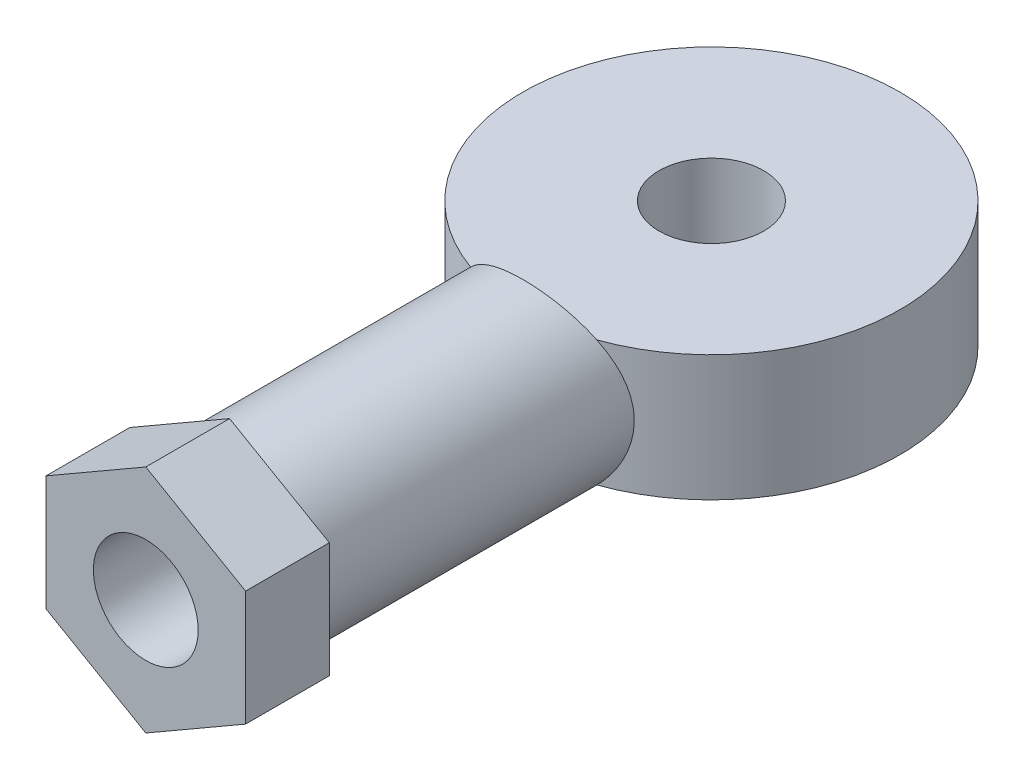
ISO-10303-21;
HEADER;
FILE_DESCRIPTION(('STEP AP214'),'2;1');
FILE_NAME('part.step','',(''),(''),'','','');
FILE_SCHEMA(('AUTOMOTIVE_DESIGN { 1 0 10303 214 1 1 1 1 }'));
ENDSEC;
DATA;
#1=APPLICATION_CONTEXT('core data for automotive mechanical design processes');
#2=APPLICATION_PROTOCOL_DEFINITION('international standard','automotive_design',2000,#1);
#3=PRODUCT_CONTEXT('',#1,'mechanical');
#4=PRODUCT('Part','Part','',(#3));
#5=PRODUCT_RELATED_PRODUCT_CATEGORY('part','',(#4));
#6=PRODUCT_DEFINITION_FORMATION('','',#4);
#7=PRODUCT_DEFINITION_CONTEXT('part definition',#1,'design');
#8=PRODUCT_DEFINITION('design','',#6,#7);
#9=PRODUCT_DEFINITION_SHAPE('','',#8);
#10=(LENGTH_UNIT() NAMED_UNIT(*) SI_UNIT(.MILLI.,.METRE.));
#11=(NAMED_UNIT(*) PLANE_ANGLE_UNIT() SI_UNIT($,.RADIAN.));
#12=(NAMED_UNIT(*) SI_UNIT($,.STERADIAN.) SOLID_ANGLE_UNIT());
#13=UNCERTAINTY_MEASURE_WITH_UNIT(LENGTH_MEASURE(1.E-05),#10,'distance_accuracy_value','');
#14=(GEOMETRIC_REPRESENTATION_CONTEXT(3) GLOBAL_UNCERTAINTY_ASSIGNED_CONTEXT((#13)) GLOBAL_UNIT_ASSIGNED_CONTEXT((#10,
#11,#12)) REPRESENTATION_CONTEXT('',''));
#15=CARTESIAN_POINT('',(0.,0.,0.));
#16=DIRECTION('',(0.,0.,1.));
#17=DIRECTION('',(1.,0.,0.));
#18=AXIS2_PLACEMENT_3D('',#15,#16,#17);
#19=CARTESIAN_POINT('',(0.,3.,5.));
#20=DIRECTION('',(0.,0.,1.));
#21=DIRECTION('',(1.,0.,0.));
#22=AXIS2_PLACEMENT_3D('',#19,#20,#21);
#23=CYLINDRICAL_SURFACE('',#22,4.25);
#24=CARTESIAN_POINT('',(0.,3.,23.));
#25=DIRECTION('',(0.,0.,1.));
#26=DIRECTION('',(1.,0.,0.));
#27=AXIS2_PLACEMENT_3D('',#24,#25,#26);
#28=CIRCLE('',#27,4.25);
#29=CARTESIAN_POINT('',(4.25,3.,23.));
#30=VERTEX_POINT('',#29);
#31=EDGE_CURVE('E175',#30,#30,#28,.T.);
#32=ORIENTED_EDGE('',*,*,#31,.F.);
#33=EDGE_LOOP('',(#32));
#34=FACE_BOUND('',#33,.T.);
#35=CARTESIAN_POINT('',(-3.01039864469807,0.,8.48159772684369));
#36=CARTESIAN_POINT('',(-2.92798697302415,-0.0827006992757874,8.51085549024708));
#37=CARTESIAN_POINT('',(-2.84213227962466,-0.16203395130952,8.53996896478856));
#38=CARTESIAN_POINT('',(-2.66395515199283,-0.313535613947908,8.59721286807979));
#39=CARTESIAN_POINT('',(-2.57163027480233,-0.385701293149573,8.62534291944274));
#40=CARTESIAN_POINT('',(-2.38048875890936,-0.52273684160147,8.6800469180092));
#41=CARTESIAN_POINT('',(-2.28164028441277,-0.587565982491989,8.70661181999646));
#42=CARTESIAN_POINT('',(-2.07843752418483,-0.708989472224683,8.75734310162683));
#43=CARTESIAN_POINT('',(-1.97408404781275,-0.765585027017189,8.78150983235821));
#44=CARTESIAN_POINT('',(-1.76012581005947,-0.87023037623691,8.82688807458339));
#45=CARTESIAN_POINT('',(-1.6505054236901,-0.918252459386683,8.84808995685823));
#46=CARTESIAN_POINT('',(-1.42704487367255,-1.00504762124792,8.88686660267383));
#47=CARTESIAN_POINT('',(-1.31320509126238,-1.04382153322345,8.9044416929708));
#48=CARTESIAN_POINT('',(-1.08257914638173,-1.11155817000089,8.93540746814014));
#49=CARTESIAN_POINT('',(-0.965806307577977,-1.14055881962551,8.94881431168796));
#50=CARTESIAN_POINT('',(-0.729861594213992,-1.18858941891615,8.97113854491265));
#51=CARTESIAN_POINT('',(-0.610691204869528,-1.20762535525866,8.98005863005218));
#52=CARTESIAN_POINT('',(-0.409470634306771,-1.23102195096429,8.991050083418));
#53=CARTESIAN_POINT('',(-0.32779820940515,-1.23813275557335,8.99440114991819));
#54=CARTESIAN_POINT('',(-0.164086748155722,-1.24762290842565,8.99887673903325));
#55=CARTESIAN_POINT('',(-0.0820475887522847,-1.25000052683793,9.00000044761808));
#56=CARTESIAN_POINT('',(0.112507487352976,-1.24999927757523,8.99999938620518));
#57=CARTESIAN_POINT('',(0.225030824558778,-1.24552688682817,8.99788500173908));
#58=CARTESIAN_POINT('',(0.449256458996656,-1.22768600247209,8.98948102749134));
#59=CARTESIAN_POINT('',(0.560958327659712,-1.21431315807871,8.98318939576103));
#60=CARTESIAN_POINT('',(0.782840596984535,-1.1787914204673,8.96657952983101));
#61=CARTESIAN_POINT('',(0.893018327263958,-1.15662875222773,8.9562549758));
#62=CARTESIAN_POINT('',(1.11089932210055,-1.10377765846816,8.93185040397307));
#63=CARTESIAN_POINT('',(1.21860160408556,-1.07308590870671,8.91776892198602));
#64=CARTESIAN_POINT('',(1.53605646482554,-0.968930728338525,8.87051410332611));
#65=CARTESIAN_POINT('',(1.74117203022949,-0.883221777819063,8.83224961699863));
#66=CARTESIAN_POINT('',(2.13371376650894,-0.68217708791253,8.74572694292992));
#67=CARTESIAN_POINT('',(2.32115128250271,-0.566860528945838,8.69747522902911));
#68=CARTESIAN_POINT('',(2.5893632356801,-0.372013238862854,8.61999283432242));
#69=CARTESIAN_POINT('',(2.67790775568925,-0.302121447439359,8.59283940156641));
#70=CARTESIAN_POINT('',(2.8488052746091,-0.15585371750705,8.53770183699303));
#71=CARTESIAN_POINT('',(2.93117257283468,-0.0794936840322524,8.50971984687424));
#72=CARTESIAN_POINT('',(3.01039864469807,0.,8.48159772684369));
#73=B_SPLINE_CURVE_WITH_KNOTS('',3,(#35,#36,#37,#38,#39,#40,#41,#42,#43,#44,#45,#46,#47,#48,#49,
#50,#51,#52,#53,#54,#55,#56,#57,#58,#59,#60,#61,#62,#63,#64,#65,#66,#67,#68,#69,#70,#71,#72),
.UNSPECIFIED.,.F.,.F.,(4,2,2,2,2,2,2,2,2,2,2,2,2,2,2,2,2,2,4),(0.,0.36100483911055,
0.722146725529575,1.08520416177244,1.44820836835558,1.81236543816587,2.17648968486746,
2.53918423642679,2.90166063477097,3.14765426057722,3.39373777283815,3.73117898304924,
4.06878526499079,4.40692273248065,4.74519217560144,5.41867598786905,6.09172459943699,
6.43950023250615,6.78644423838688),.UNSPECIFIED.);
#74=CARTESIAN_POINT('',(-3.01039864469807,0.,8.48159772684369));
#75=VERTEX_POINT('',#74);
#76=CARTESIAN_POINT('',(3.01039864469807,0.,8.48159772684369));
#77=VERTEX_POINT('',#76);
#78=EDGE_CURVE('E135',#75,#77,#73,.T.);
#79=ORIENTED_EDGE('',*,*,#78,.T.);
#80=CARTESIAN_POINT('',(3.01039864469807,6.,8.48159772684369));
#81=CARTESIAN_POINT('',(3.09347285150798,5.91663886327544,8.45211557896374));
#82=CARTESIAN_POINT('',(3.17306077066301,5.82984876980757,8.42248909129286));
#83=CARTESIAN_POINT('',(3.32489897536904,5.64979712619114,8.36371116738));
#84=CARTESIAN_POINT('',(3.39714339848947,5.55653050415388,8.33456012603945));
#85=CARTESIAN_POINT('',(3.53411221704745,5.36360118980779,8.27741434297059));
#86=CARTESIAN_POINT('',(3.59880033248796,5.26391094144638,8.24942556476663));
#87=CARTESIAN_POINT('',(3.71981356560247,5.05903835400034,8.19557034924834));
#88=CARTESIAN_POINT('',(3.77613947074252,4.95385653331741,8.16970371219557));
#89=CARTESIAN_POINT('',(3.88013570075328,4.73822291208056,8.12082883119371));
#90=CARTESIAN_POINT('',(3.92777813421679,4.62775552028212,8.09782987045729));
#91=CARTESIAN_POINT('',(4.01369570762586,4.40258987659313,8.05559061007096));
#92=CARTESIAN_POINT('',(4.05197511510646,4.28789357971188,8.03634859886639));
#93=CARTESIAN_POINT('',(4.11867363610431,4.0552878177845,8.0023701460643));
#94=CARTESIAN_POINT('',(4.14711426855598,3.93738598127306,7.98762388007192));
#95=CARTESIAN_POINT('',(4.19386796817389,3.6990782950046,7.96317595348376));
#96=CARTESIAN_POINT('',(4.21218213783031,3.57867271931675,7.95347374373741));
#97=CARTESIAN_POINT('',(4.2373770913619,3.34601177393237,7.94007685308261));
#98=CARTESIAN_POINT('',(4.24504783075976,3.23386528588899,7.93596759612591));
#99=CARTESIAN_POINT('',(4.25147601827591,3.00920360221286,7.93252579454148));
#100=CARTESIAN_POINT('',(4.25023044673257,2.89668829456897,7.93319486817718));
#101=CARTESIAN_POINT('',(4.23883255032256,2.6722555209794,7.93929105656978));
#102=CARTESIAN_POINT('',(4.22868178787492,2.5603379536253,7.94471733667293));
#103=CARTESIAN_POINT('',(4.19961753290903,2.33794948180376,7.96011748037306));
#104=CARTESIAN_POINT('',(4.18070071214941,2.22747914320632,7.97009307120061));
#105=CARTESIAN_POINT('',(4.11378577551714,1.91209850289954,8.00495321231407));
#106=CARTESIAN_POINT('',(4.05486058726876,1.70998768143906,8.03522296716927));
#107=CARTESIAN_POINT('',(3.90879099126333,1.31843803376613,8.10727539694965));
#108=CARTESIAN_POINT('',(3.82162348850656,1.12900973211291,8.14906749002116));
#109=CARTESIAN_POINT('',(3.62531963668722,0.773051894100289,8.23821593078995));
#110=CARTESIAN_POINT('',(3.51712930256453,0.605930158403899,8.28530496967308));
#111=CARTESIAN_POINT('',(3.27931642079094,0.28933423315033,8.38227809869223));
#112=CARTESIAN_POINT('',(3.14975244811411,0.139813674925143,8.43215431008888));
#113=CARTESIAN_POINT('',(3.01039864469807,0.,8.48159772684369));
#114=B_SPLINE_CURVE_WITH_KNOTS('',3,(#80,#81,#82,#83,#84,#85,#86,#87,#88,#89,#90,#91,#92,#93,
#94,#95,#96,#97,#98,#99,#100,#101,#102,#103,#104,#105,#106,#107,#108,#109,#110,#111,#112,#113),
.UNSPECIFIED.,.F.,.F.,(4,2,2,2,2,2,2,2,2,2,2,2,2,2,2,2,4),(0.,0.363881820486711,
0.728051889107149,1.09390422130228,1.45972207944417,1.82669500155159,2.19350034959463,
2.55949828836047,2.92545637227964,3.26246018390325,3.59957813304586,3.93663694654531,
4.27382383737787,4.90893912694591,5.5445750949937,6.15638354679443,6.76654235864214),.UNSPECIFIED.);
#115=CARTESIAN_POINT('',(3.01039864469807,6.,8.48159772684369));
#116=VERTEX_POINT('',#115);
#117=EDGE_CURVE('E55',#116,#77,#114,.T.);
#118=ORIENTED_EDGE('',*,*,#117,.F.);
#119=CARTESIAN_POINT('',(3.01039864469807,6.,8.48159772684369));
#120=CARTESIAN_POINT('',(2.92790824367343,6.08277973603953,8.51088346897044));
#121=CARTESIAN_POINT('',(2.84196812380461,6.16218564632046,8.54002464657201));
#122=CARTESIAN_POINT('',(2.66361171188871,6.31381548646433,8.5973202659881));
#123=CARTESIAN_POINT('',(2.571193224286,6.38603696122484,8.62547436838038));
#124=CARTESIAN_POINT('',(2.38003301386177,6.52304104528022,8.68017092159719));
#125=CARTESIAN_POINT('',(2.28127069840336,6.58779730181234,8.70670751600722));
#126=CARTESIAN_POINT('',(2.07824725099883,6.7090926692203,8.75738717137499));
#127=CARTESIAN_POINT('',(1.97398670838543,6.76563265833462,8.78153048806287));
#128=CARTESIAN_POINT('',(1.76025753682565,6.87016592626651,8.82686012566223));
#129=CARTESIAN_POINT('',(1.65077488148247,6.91813432963648,8.84803780276689));
#130=CARTESIAN_POINT('',(1.42759740238537,7.00484642777117,8.88677609766163));
#131=CARTESIAN_POINT('',(1.31390285876138,7.04359073475617,8.90433695549623));
#132=CARTESIAN_POINT('',(1.08332045269081,7.11136606726944,8.93531888317323));
#133=CARTESIAN_POINT('',(0.966438579065952,7.14041411185929,8.94874720325426));
#134=CARTESIAN_POINT('',(0.730218209048673,7.18853274496845,8.97111205244641));
#135=CARTESIAN_POINT('',(0.610879912936697,7.20760414359465,8.98004894626049));
#136=CARTESIAN_POINT('',(0.378641715998417,7.23460585133301,8.99273349611889));
#137=CARTESIAN_POINT('',(0.265833369962613,7.24318527998721,8.99678326332585));
#138=CARTESIAN_POINT('',(0.0397784775205806,7.2513189079735,9.00062214408969));
#139=CARTESIAN_POINT('',(-0.0734682029020594,7.25087008589902,9.00040983129316));
#140=CARTESIAN_POINT('',(-0.299440006405073,7.24094594298957,8.99572696161062));
#141=CARTESIAN_POINT('',(-0.412165280534243,7.23147342539354,8.99125772715054));
#142=CARTESIAN_POINT('',(-0.636305973964458,7.20361448353614,8.97818043968852));
#143=CARTESIAN_POINT('',(-0.747720886936529,7.18522472248202,8.96957083738936));
#144=CARTESIAN_POINT('',(-0.963752554849639,7.14069151545059,8.94888000359987));
#145=CARTESIAN_POINT('',(-1.06845850091389,7.11490541910884,8.9369594319302));
#146=CARTESIAN_POINT('',(-1.27522937136514,7.05559806404708,8.90980854363838));
#147=CARTESIAN_POINT('',(-1.37729336534867,7.0220741204591,8.89457707831382));
#148=CARTESIAN_POINT('',(-1.67865712353719,6.91030068020458,8.84440266673445));
#149=CARTESIAN_POINT('',(-1.87318166944836,6.82083850790478,8.80497437469183));
#150=CARTESIAN_POINT('',(-2.2347855807054,6.62058180837328,8.7199993905659));
#151=CARTESIAN_POINT('',(-2.40278807518486,6.51124204277822,8.67491212434078));
#152=CARTESIAN_POINT('',(-2.64120870873057,6.33112933042184,8.60412050763671));
#153=CARTESIAN_POINT('',(-2.71835675048733,6.26846983224964,8.58001900772031));
#154=CARTESIAN_POINT('',(-2.86795388546131,6.13802167881455,8.53118005833563));
#155=CARTESIAN_POINT('',(-2.94040364361378,6.07023375231927,8.50644269955374));
#156=CARTESIAN_POINT('',(-3.01039864469807,6.,8.48159772684369));
#157=B_SPLINE_CURVE_WITH_KNOTS('',3,(#119,#120,#121,#122,#123,#124,#125,#126,#127,#128,#129,
#130,#131,#132,#133,#134,#135,#136,#137,#138,#139,#140,#141,#142,#143,#144,#145,#146,#147,#148,
#149,#150,#151,#152,#153,#154,#155,#156),.UNSPECIFIED.,.F.,.F.,(4,2,2,2,2,2,2,2,2,2,2,2,2,2,2,2,
2,2,4),(0.,0.361349856668882,0.722822774524778,1.08553498756669,1.4482084016636,
1.81191780980218,2.17560307114321,2.53864658685233,2.90166061873213,3.24084684507364,
3.58014658582371,3.91934095642069,4.25866235010122,4.5837594243027,4.90896947028094,
5.5592282213965,6.17349645243601,6.48009389202559,6.78664784458862),.UNSPECIFIED.);
#158=CARTESIAN_POINT('',(-3.01039864469807,6.,8.48159772684369));
#159=VERTEX_POINT('',#158);
#160=EDGE_CURVE('E11',#116,#159,#157,.T.);
#161=ORIENTED_EDGE('',*,*,#160,.T.);
#162=CARTESIAN_POINT('',(-3.01039864469807,0.,8.48159772684369));
#163=CARTESIAN_POINT('',(-3.09347285150798,0.0833611367245638,8.45211557896374));
#164=CARTESIAN_POINT('',(-3.17306077066301,0.170151230192427,8.42248909129286));
#165=CARTESIAN_POINT('',(-3.32489897536904,0.350202873808865,8.36371116738));
#166=CARTESIAN_POINT('',(-3.39714339848947,0.443469495846123,8.33456012603945));
#167=CARTESIAN_POINT('',(-3.53411221704746,0.636398810192209,8.27741434297059));
#168=CARTESIAN_POINT('',(-3.59880033248796,0.736089058553623,8.24942556476663));
#169=CARTESIAN_POINT('',(-3.71981356560247,0.94096164599966,8.19557034924834));
#170=CARTESIAN_POINT('',(-3.77613947074252,1.04614346668259,8.16970371219557));
#171=CARTESIAN_POINT('',(-3.88013570075328,1.26177708791944,8.12082883119371));
#172=CARTESIAN_POINT('',(-3.92777813421679,1.37224447971788,8.09782987045729));
#173=CARTESIAN_POINT('',(-4.01369570762586,1.59741012340687,8.05559061007096));
#174=CARTESIAN_POINT('',(-4.05197511510646,1.71210642028812,8.03634859886639));
#175=CARTESIAN_POINT('',(-4.11867363610431,1.9447121822155,8.0023701460643));
#176=CARTESIAN_POINT('',(-4.14711426855598,2.06261401872694,7.98762388007192));
#177=CARTESIAN_POINT('',(-4.19386796817389,2.3009217049954,7.96317595348376));
#178=CARTESIAN_POINT('',(-4.21218213783031,2.42132728068325,7.95347374373741));
#179=CARTESIAN_POINT('',(-4.2373770913619,2.65398822606763,7.94007685308261));
#180=CARTESIAN_POINT('',(-4.24504783075976,2.76613471411101,7.93596759612591));
#181=CARTESIAN_POINT('',(-4.2514760182759,2.99079639778713,7.93252579454148));
#182=CARTESIAN_POINT('',(-4.25023044673257,3.10331170543103,7.93319486817718));
#183=CARTESIAN_POINT('',(-4.23883255032256,3.3277444790206,7.93929105656978));
#184=CARTESIAN_POINT('',(-4.22868178787492,3.4396620463747,7.94471733667293));
#185=CARTESIAN_POINT('',(-4.19961753290903,3.66205051819624,7.96011748037306));
#186=CARTESIAN_POINT('',(-4.18070071214941,3.77252085679368,7.97009307120061));
#187=CARTESIAN_POINT('',(-4.11378577551714,4.08790149710046,8.00495321231407));
#188=CARTESIAN_POINT('',(-4.05486058726876,4.29001231856094,8.03522296716927));
#189=CARTESIAN_POINT('',(-3.90879099126333,4.68156196623387,8.10727539694964));
#190=CARTESIAN_POINT('',(-3.82162348850656,4.87099026788709,8.14906749002116));
#191=CARTESIAN_POINT('',(-3.62531963668722,5.22694810589971,8.23821593078995));
#192=CARTESIAN_POINT('',(-3.51712930256453,5.3940698415961,8.28530496967308));
#193=CARTESIAN_POINT('',(-3.27931642079094,5.71066576684967,8.38227809869223));
#194=CARTESIAN_POINT('',(-3.14975244811411,5.86018632507486,8.43215431008888));
#195=CARTESIAN_POINT('',(-3.01039864469807,6.,8.48159772684369));
#196=B_SPLINE_CURVE_WITH_KNOTS('',3,(#162,#163,#164,#165,#166,#167,#168,#169,#170,#171,#172,
#173,#174,#175,#176,#177,#178,#179,#180,#181,#182,#183,#184,#185,#186,#187,#188,#189,#190,#191,
#192,#193,#194,#195),.UNSPECIFIED.,.F.,.F.,(4,2,2,2,2,2,2,2,2,2,2,2,2,2,2,2,4),(0.,
0.363881820486711,0.728051889107149,1.09390422130228,1.45972207944417,1.82669500155158,
2.19350034959463,2.55949828836047,2.92545637227964,3.26246018390325,3.59957813304586,
3.93663694654531,4.27382383737787,4.90893912694591,5.5445750949937,6.15638354679443,
6.76654235864214),.UNSPECIFIED.);
#197=EDGE_CURVE('E182',#75,#159,#196,.T.);
#198=ORIENTED_EDGE('',*,*,#197,.F.);
#199=EDGE_LOOP('',(#79,#118,#161,#198));
#200=FACE_BOUND('',#199,.T.);
#201=ADVANCED_FACE('F41',(#34,#200),#23,.T.);
#202=CARTESIAN_POINT('',(0.,6.,0.));
#203=DIRECTION('',(0.,1.,0.));
#204=DIRECTION('',(0.,0.,1.));
#205=AXIS2_PLACEMENT_3D('',#202,#203,#204);
#206=PLANE('',#205);
#207=CARTESIAN_POINT('',(0.,6.,0.));
#208=DIRECTION('',(0.,1.,0.));
#209=DIRECTION('',(0.,0.,1.));
#210=AXIS2_PLACEMENT_3D('',#207,#208,#209);
#211=CIRCLE('',#210,9.);
#212=EDGE_CURVE('E189',#116,#159,#211,.T.);
#213=ORIENTED_EDGE('',*,*,#212,.T.);
#214=CARTESIAN_POINT('',(0.,6.,0.));
#215=DIRECTION('',(0.,1.,0.));
#216=DIRECTION('',(0.,0.,1.));
#217=AXIS2_PLACEMENT_3D('',#214,#215,#216);
#218=CIRCLE('',#217,9.);
#219=EDGE_CURVE('E61',#159,#116,#218,.T.);
#220=ORIENTED_EDGE('',*,*,#219,.T.);
#221=EDGE_LOOP('',(#213,#220));
#222=FACE_BOUND('',#221,.T.);
#223=CARTESIAN_POINT('',(0.,6.,0.));
#224=DIRECTION('',(0.,1.,0.));
#225=DIRECTION('',(0.,0.,1.));
#226=AXIS2_PLACEMENT_3D('',#223,#224,#225);
#227=CIRCLE('',#226,2.5);
#228=CARTESIAN_POINT('',(0.,6.,2.5));
#229=VERTEX_POINT('',#228);
#230=EDGE_CURVE('E191',#229,#229,#227,.T.);
#231=ORIENTED_EDGE('',*,*,#230,.F.);
#232=EDGE_LOOP('',(#231));
#233=FACE_BOUND('',#232,.T.);
#234=ADVANCED_FACE('F164',(#222,#233),#206,.T.);
#235=CARTESIAN_POINT('',(0.,0.,0.));
#236=DIRECTION('',(0.,1.,0.));
#237=DIRECTION('',(0.,0.,1.));
#238=AXIS2_PLACEMENT_3D('',#235,#236,#237);
#239=PLANE('',#238);
#240=CARTESIAN_POINT('',(0.,0.,0.));
#241=DIRECTION('',(0.,-1.,0.));
#242=DIRECTION('',(0.,0.,-1.));
#243=AXIS2_PLACEMENT_3D('',#240,#241,#242);
#244=CIRCLE('',#243,9.);
#245=EDGE_CURVE('E132',#77,#75,#244,.T.);
#246=ORIENTED_EDGE('',*,*,#245,.T.);
#247=CARTESIAN_POINT('',(0.,0.,0.));
#248=DIRECTION('',(0.,1.,0.));
#249=DIRECTION('',(0.,0.,1.));
#250=AXIS2_PLACEMENT_3D('',#247,#248,#249);
#251=CIRCLE('',#250,9.);
#252=EDGE_CURVE('E187',#77,#75,#251,.T.);
#253=ORIENTED_EDGE('',*,*,#252,.F.);
#254=EDGE_LOOP('',(#246,#253));
#255=FACE_BOUND('',#254,.T.);
#256=CARTESIAN_POINT('',(0.,0.,0.));
#257=DIRECTION('',(0.,1.,0.));
#258=DIRECTION('',(0.,0.,1.));
#259=AXIS2_PLACEMENT_3D('',#256,#257,#258);
#260=CIRCLE('',#259,2.5);
#261=CARTESIAN_POINT('',(0.,0.,2.5));
#262=VERTEX_POINT('',#261);
#263=EDGE_CURVE('E195',#262,#262,#260,.T.);
#264=ORIENTED_EDGE('',*,*,#263,.T.);
#265=EDGE_LOOP('',(#264));
#266=FACE_BOUND('',#265,.T.);
#267=ADVANCED_FACE('F169',(#255,#266),#239,.F.);
#268=CARTESIAN_POINT('',(0.,6.,0.));
#269=DIRECTION('',(0.,-1.,0.));
#270=DIRECTION('',(0.,0.,-1.));
#271=AXIS2_PLACEMENT_3D('',#268,#269,#270);
#272=CYLINDRICAL_SURFACE('',#271,9.);
#273=ORIENTED_EDGE('',*,*,#212,.F.);
#274=ORIENTED_EDGE('',*,*,#117,.T.);
#275=ORIENTED_EDGE('',*,*,#252,.T.);
#276=ORIENTED_EDGE('',*,*,#197,.T.);
#277=EDGE_LOOP('',(#273,#274,#275,#276));
#278=FACE_BOUND('',#277,.T.);
#279=ADVANCED_FACE('F43',(#278),#272,.T.);
#280=CARTESIAN_POINT('',(0.,6.,0.));
#281=DIRECTION('',(0.,-1.,0.));
#282=DIRECTION('',(0.,0.,-1.));
#283=AXIS2_PLACEMENT_3D('',#280,#281,#282);
#284=CYLINDRICAL_SURFACE('',#283,2.5);
#285=ORIENTED_EDGE('',*,*,#230,.T.);
#286=EDGE_LOOP('',(#285));
#287=FACE_BOUND('',#286,.T.);
#288=ORIENTED_EDGE('',*,*,#263,.F.);
#289=EDGE_LOOP('',(#288));
#290=FACE_BOUND('',#289,.T.);
#291=ADVANCED_FACE('F158',(#287,#290),#284,.F.);
#292=CARTESIAN_POINT('',(0.,7.25,0.));
#293=DIRECTION('',(0.,-1.,0.));
#294=DIRECTION('',(0.,0.,-1.));
#295=AXIS2_PLACEMENT_3D('',#292,#293,#294);
#296=CYLINDRICAL_SURFACE('',#295,9.);
#297=ORIENTED_EDGE('',*,*,#219,.F.);
#298=ORIENTED_EDGE('',*,*,#160,.F.);
#299=EDGE_LOOP('',(#297,#298));
#300=FACE_BOUND('',#299,.T.);
#301=ADVANCED_FACE('F153',(#300),#296,.F.);
#302=CARTESIAN_POINT('',(0.,-1.25,0.));
#303=DIRECTION('',(0.,1.,0.));
#304=DIRECTION('',(0.,0.,1.));
#305=AXIS2_PLACEMENT_3D('',#302,#303,#304);
#306=CYLINDRICAL_SURFACE('',#305,9.);
#307=ORIENTED_EDGE('',*,*,#78,.F.);
#308=ORIENTED_EDGE('',*,*,#245,.F.);
#309=EDGE_LOOP('',(#307,#308));
#310=FACE_BOUND('',#309,.T.);
#311=ADVANCED_FACE('F149',(#310),#306,.F.);
#312=CARTESIAN_POINT('',(4.76313972081438,5.75000000000006,27.));
#313=DIRECTION('',(-0.499999999999995,-0.866025403784441,0.));
#314=DIRECTION('',(0.866025403784442,-0.499999999999995,0.));
#315=AXIS2_PLACEMENT_3D('',#312,#313,#314);
#316=PLANE('',#315);
#317=DIRECTION('',(-0.866025403784441,0.499999999999995,0.));
#318=VECTOR('',#317,1.);
#319=CARTESIAN_POINT('',(4.76313972081438,5.75000000000006,23.));
#320=LINE('',#319,#318);
#321=CARTESIAN_POINT('',(4.76313972081438,5.75000000000006,23.));
#322=VERTEX_POINT('',#321);
#323=CARTESIAN_POINT('',(0.,8.5,23.));
#324=VERTEX_POINT('',#323);
#325=EDGE_CURVE('E131',#322,#324,#320,.T.);
#326=ORIENTED_EDGE('',*,*,#325,.T.);
#327=DIRECTION('',(0.,0.,-1.));
#328=VECTOR('',#327,1.);
#329=CARTESIAN_POINT('',(0.,8.5,27.));
#330=LINE('',#329,#328);
#331=CARTESIAN_POINT('',(0.,8.5,27.));
#332=VERTEX_POINT('',#331);
#333=EDGE_CURVE('E111',#332,#324,#330,.T.);
#334=ORIENTED_EDGE('',*,*,#333,.F.);
#335=DIRECTION('',(-0.866025403784441,0.499999999999995,0.));
#336=VECTOR('',#335,1.);
#337=CARTESIAN_POINT('',(4.76313972081438,5.75000000000006,27.));
#338=LINE('',#337,#336);
#339=CARTESIAN_POINT('',(4.76313972081438,5.75000000000006,27.));
#340=VERTEX_POINT('',#339);
#341=EDGE_CURVE('E118',#340,#332,#338,.T.);
#342=ORIENTED_EDGE('',*,*,#341,.F.);
#343=DIRECTION('',(0.,0.,-1.));
#344=VECTOR('',#343,1.);
#345=CARTESIAN_POINT('',(4.76313972081438,5.75000000000006,27.));
#346=LINE('',#345,#344);
#347=EDGE_CURVE('E363',#340,#322,#346,.T.);
#348=ORIENTED_EDGE('',*,*,#347,.T.);
#349=EDGE_LOOP('',(#326,#334,#342,#348));
#350=FACE_BOUND('',#349,.T.);
#351=ADVANCED_FACE('F129',(#350),#316,.F.);
#352=CARTESIAN_POINT('',(0.,8.5,27.));
#353=DIRECTION('',(0.500000000000001,-0.866025403784438,0.));
#354=DIRECTION('',(0.866025403784438,0.500000000000001,0.));
#355=AXIS2_PLACEMENT_3D('',#352,#353,#354);
#356=PLANE('',#355);
#357=DIRECTION('',(-0.866025403784438,-0.500000000000001,0.));
#358=VECTOR('',#357,1.);
#359=CARTESIAN_POINT('',(0.,8.5,23.));
#360=LINE('',#359,#358);
#361=CARTESIAN_POINT('',(-4.76313972081442,5.74999999999999,23.));
#362=VERTEX_POINT('',#361);
#363=EDGE_CURVE('E353',#324,#362,#360,.T.);
#364=ORIENTED_EDGE('',*,*,#363,.T.);
#365=DIRECTION('',(0.,0.,-1.));
#366=VECTOR('',#365,1.);
#367=CARTESIAN_POINT('',(-4.76313972081442,5.74999999999999,27.));
#368=LINE('',#367,#366);
#369=CARTESIAN_POINT('',(-4.76313972081442,5.74999999999999,27.));
#370=VERTEX_POINT('',#369);
#371=EDGE_CURVE('E114',#370,#362,#368,.T.);
#372=ORIENTED_EDGE('',*,*,#371,.F.);
#373=DIRECTION('',(-0.866025403784438,-0.500000000000001,0.));
#374=VECTOR('',#373,1.);
#375=CARTESIAN_POINT('',(0.,8.5,27.));
#376=LINE('',#375,#374);
#377=EDGE_CURVE('E107',#332,#370,#376,.T.);
#378=ORIENTED_EDGE('',*,*,#377,.F.);
#379=ORIENTED_EDGE('',*,*,#333,.T.);
#380=EDGE_LOOP('',(#364,#372,#378,#379));
#381=FACE_BOUND('',#380,.T.);
#382=ADVANCED_FACE('F109',(#381),#356,.F.);
#383=CARTESIAN_POINT('',(-4.76313972081442,5.74999999999999,27.));
#384=DIRECTION('',(1.,0.,0.));
#385=DIRECTION('',(0.,1.,0.));
#386=AXIS2_PLACEMENT_3D('',#383,#384,#385);
#387=PLANE('',#386);
#388=DIRECTION('',(0.,-1.,0.));
#389=VECTOR('',#388,1.);
#390=CARTESIAN_POINT('',(-4.76313972081442,5.74999999999999,23.));
#391=LINE('',#390,#389);
#392=CARTESIAN_POINT('',(-4.7631397208144,0.249999999999978,23.));
#393=VERTEX_POINT('',#392);
#394=EDGE_CURVE('E366',#362,#393,#391,.T.);
#395=ORIENTED_EDGE('',*,*,#394,.T.);
#396=DIRECTION('',(0.,0.,-1.));
#397=VECTOR('',#396,1.);
#398=CARTESIAN_POINT('',(-4.7631397208144,0.249999999999978,27.));
#399=LINE('',#398,#397);
#400=CARTESIAN_POINT('',(-4.7631397208144,0.249999999999978,27.));
#401=VERTEX_POINT('',#400);
#402=EDGE_CURVE('E137',#401,#393,#399,.T.);
#403=ORIENTED_EDGE('',*,*,#402,.F.);
#404=DIRECTION('',(0.,-1.,0.));
#405=VECTOR('',#404,1.);
#406=CARTESIAN_POINT('',(-4.76313972081442,5.74999999999999,27.));
#407=LINE('',#406,#405);
#408=EDGE_CURVE('E117',#370,#401,#407,.T.);
#409=ORIENTED_EDGE('',*,*,#408,.F.);
#410=ORIENTED_EDGE('',*,*,#371,.T.);
#411=EDGE_LOOP('',(#395,#403,#409,#410));
#412=FACE_BOUND('',#411,.T.);
#413=ADVANCED_FACE('F263',(#412),#387,.F.);
#414=CARTESIAN_POINT('',(-4.7631397208144,0.249999999999978,27.));
#415=DIRECTION('',(0.499999999999995,0.866025403784441,0.));
#416=DIRECTION('',(-0.866025403784442,0.499999999999995,0.));
#417=AXIS2_PLACEMENT_3D('',#414,#415,#416);
#418=PLANE('',#417);
#419=DIRECTION('',(0.866025403784441,-0.499999999999995,0.));
#420=VECTOR('',#419,1.);
#421=CARTESIAN_POINT('',(-4.7631397208144,0.249999999999978,23.));
#422=LINE('',#421,#420);
#423=CARTESIAN_POINT('',(0.,-2.5,23.));
#424=VERTEX_POINT('',#423);
#425=EDGE_CURVE('E368',#393,#424,#422,.T.);
#426=ORIENTED_EDGE('',*,*,#425,.T.);
#427=DIRECTION('',(0.,0.,-1.));
#428=VECTOR('',#427,1.);
#429=CARTESIAN_POINT('',(0.,-2.5,27.));
#430=LINE('',#429,#428);
#431=CARTESIAN_POINT('',(0.,-2.5,27.));
#432=VERTEX_POINT('',#431);
#433=EDGE_CURVE('E377',#432,#424,#430,.T.);
#434=ORIENTED_EDGE('',*,*,#433,.F.);
#435=DIRECTION('',(0.866025403784441,-0.499999999999995,0.));
#436=VECTOR('',#435,1.);
#437=CARTESIAN_POINT('',(-4.7631397208144,0.249999999999978,27.));
#438=LINE('',#437,#436);
#439=EDGE_CURVE('E359',#401,#432,#438,.T.);
#440=ORIENTED_EDGE('',*,*,#439,.F.);
#441=ORIENTED_EDGE('',*,*,#402,.T.);
#442=EDGE_LOOP('',(#426,#434,#440,#441));
#443=FACE_BOUND('',#442,.T.);
#444=ADVANCED_FACE('F270',(#443),#418,.F.);
#445=CARTESIAN_POINT('',(0.,-2.5,27.));
#446=DIRECTION('',(-0.500000000000007,0.866025403784435,0.));
#447=DIRECTION('',(-0.866025403784435,-0.500000000000007,0.));
#448=AXIS2_PLACEMENT_3D('',#445,#446,#447);
#449=PLANE('',#448);
#450=DIRECTION('',(0.866025403784434,0.500000000000007,0.));
#451=VECTOR('',#450,1.);
#452=CARTESIAN_POINT('',(0.,-2.5,23.));
#453=LINE('',#452,#451);
#454=CARTESIAN_POINT('',(4.76313972081444,0.250000000000044,23.));
#455=VERTEX_POINT('',#454);
#456=EDGE_CURVE('E370',#424,#455,#453,.T.);
#457=ORIENTED_EDGE('',*,*,#456,.T.);
#458=DIRECTION('',(0.,0.,-1.));
#459=VECTOR('',#458,1.);
#460=CARTESIAN_POINT('',(4.76313972081444,0.250000000000044,27.));
#461=LINE('',#460,#459);
#462=CARTESIAN_POINT('',(4.76313972081444,0.250000000000044,27.));
#463=VERTEX_POINT('',#462);
#464=EDGE_CURVE('E374',#463,#455,#461,.T.);
#465=ORIENTED_EDGE('',*,*,#464,.F.);
#466=DIRECTION('',(0.866025403784434,0.500000000000007,0.));
#467=VECTOR('',#466,1.);
#468=CARTESIAN_POINT('',(0.,-2.5,27.));
#469=LINE('',#468,#467);
#470=EDGE_CURVE('E361',#432,#463,#469,.T.);
#471=ORIENTED_EDGE('',*,*,#470,.F.);
#472=ORIENTED_EDGE('',*,*,#433,.T.);
#473=EDGE_LOOP('',(#457,#465,#471,#472));
#474=FACE_BOUND('',#473,.T.);
#475=ADVANCED_FACE('F279',(#474),#449,.F.);
#476=CARTESIAN_POINT('',(4.76313972081444,0.250000000000044,27.));
#477=DIRECTION('',(-1.,0.,0.));
#478=DIRECTION('',(0.,-1.,0.));
#479=AXIS2_PLACEMENT_3D('',#476,#477,#478);
#480=PLANE('',#479);
#481=DIRECTION('',(0.,1.,0.));
#482=VECTOR('',#481,1.);
#483=CARTESIAN_POINT('',(4.76313972081444,0.250000000000044,23.));
#484=LINE('',#483,#482);
#485=EDGE_CURVE('E127',#455,#322,#484,.T.);
#486=ORIENTED_EDGE('',*,*,#485,.T.);
#487=ORIENTED_EDGE('',*,*,#347,.F.);
#488=DIRECTION('',(0.,1.,0.));
#489=VECTOR('',#488,1.);
#490=CARTESIAN_POINT('',(4.76313972081444,0.250000000000044,27.));
#491=LINE('',#490,#489);
#492=EDGE_CURVE('E123',#463,#340,#491,.T.);
#493=ORIENTED_EDGE('',*,*,#492,.F.);
#494=ORIENTED_EDGE('',*,*,#464,.T.);
#495=EDGE_LOOP('',(#486,#487,#493,#494));
#496=FACE_BOUND('',#495,.T.);
#497=ADVANCED_FACE('F288',(#496),#480,.F.);
#498=CARTESIAN_POINT('',(0.,0.,27.));
#499=DIRECTION('',(0.,0.,1.));
#500=DIRECTION('',(1.,0.,0.));
#501=AXIS2_PLACEMENT_3D('',#498,#499,#500);
#502=PLANE('',#501);
#503=CARTESIAN_POINT('',(0.,2.99999999999998,27.));
#504=DIRECTION('',(0.,0.,1.));
#505=DIRECTION('',(1.,0.,0.));
#506=AXIS2_PLACEMENT_3D('',#503,#504,#505);
#507=CIRCLE('',#506,2.5);
#508=CARTESIAN_POINT('',(2.5,2.99999999999998,27.));
#509=VERTEX_POINT('',#508);
#510=EDGE_CURVE('E351',#509,#509,#507,.T.);
#511=ORIENTED_EDGE('',*,*,#510,.F.);
#512=EDGE_LOOP('',(#511));
#513=FACE_BOUND('',#512,.T.);
#514=ORIENTED_EDGE('',*,*,#341,.T.);
#515=ORIENTED_EDGE('',*,*,#377,.T.);
#516=ORIENTED_EDGE('',*,*,#408,.T.);
#517=ORIENTED_EDGE('',*,*,#439,.T.);
#518=ORIENTED_EDGE('',*,*,#470,.T.);
#519=ORIENTED_EDGE('',*,*,#492,.T.);
#520=EDGE_LOOP('',(#514,#515,#516,#517,#518,#519));
#521=FACE_BOUND('',#520,.T.);
#522=ADVANCED_FACE('F121',(#513,#521),#502,.T.);
#523=CARTESIAN_POINT('',(0.,0.,23.));
#524=DIRECTION('',(0.,0.,1.));
#525=DIRECTION('',(1.,0.,0.));
#526=AXIS2_PLACEMENT_3D('',#523,#524,#525);
#527=PLANE('',#526);
#528=ORIENTED_EDGE('',*,*,#31,.T.);
#529=EDGE_LOOP('',(#528));
#530=FACE_BOUND('',#529,.T.);
#531=ORIENTED_EDGE('',*,*,#325,.F.);
#532=ORIENTED_EDGE('',*,*,#485,.F.);
#533=ORIENTED_EDGE('',*,*,#456,.F.);
#534=ORIENTED_EDGE('',*,*,#425,.F.);
#535=ORIENTED_EDGE('',*,*,#394,.F.);
#536=ORIENTED_EDGE('',*,*,#363,.F.);
#537=EDGE_LOOP('',(#531,#532,#533,#534,#535,#536));
#538=FACE_BOUND('',#537,.T.);
#539=ADVANCED_FACE('F306',(#530,#538),#527,.F.);
#540=CARTESIAN_POINT('',(0.,2.99999999999998,12.));
#541=DIRECTION('',(0.,0.,1.));
#542=DIRECTION('',(1.,0.,0.));
#543=AXIS2_PLACEMENT_3D('',#540,#541,#542);
#544=CYLINDRICAL_SURFACE('',#543,2.5);
#545=CARTESIAN_POINT('',(0.,2.99999999999998,12.));
#546=DIRECTION('',(0.,0.,1.));
#547=DIRECTION('',(1.,0.,0.));
#548=AXIS2_PLACEMENT_3D('',#545,#546,#547);
#549=CIRCLE('',#548,2.5);
#550=CARTESIAN_POINT('',(2.5,2.99999999999998,12.));
#551=VERTEX_POINT('',#550);
#552=EDGE_CURVE('E350',#551,#551,#549,.T.);
#553=ORIENTED_EDGE('',*,*,#552,.F.);
#554=EDGE_LOOP('',(#553));
#555=FACE_BOUND('',#554,.T.);
#556=ORIENTED_EDGE('',*,*,#510,.T.);
#557=EDGE_LOOP('',(#556));
#558=FACE_BOUND('',#557,.T.);
#559=ADVANCED_FACE('F315',(#555,#558),#544,.F.);
#560=CARTESIAN_POINT('',(0.,2.99999999999998,12.));
#561=DIRECTION('',(0.,0.,1.));
#562=DIRECTION('',(1.,0.,0.));
#563=AXIS2_PLACEMENT_3D('',#560,#561,#562);
#564=PLANE('',#563);
#565=ORIENTED_EDGE('',*,*,#552,.T.);
#566=EDGE_LOOP('',(#565));
#567=FACE_BOUND('',#566,.T.);
#568=ADVANCED_FACE('F322',(#567),#564,.T.);
#569=CLOSED_SHELL('',(#201,#234,#267,#279,#291,#301,#311,#351,#382,#413,#444,#475,#497,#522,
#539,#559,#568));
#570=MANIFOLD_SOLID_BREP('B2',#569);
#571=ADVANCED_BREP_SHAPE_REPRESENTATION('',(#18,#570),#14);
#572=SHAPE_DEFINITION_REPRESENTATION(#9,#571);
ENDSEC;
END-ISO-10303-21;
